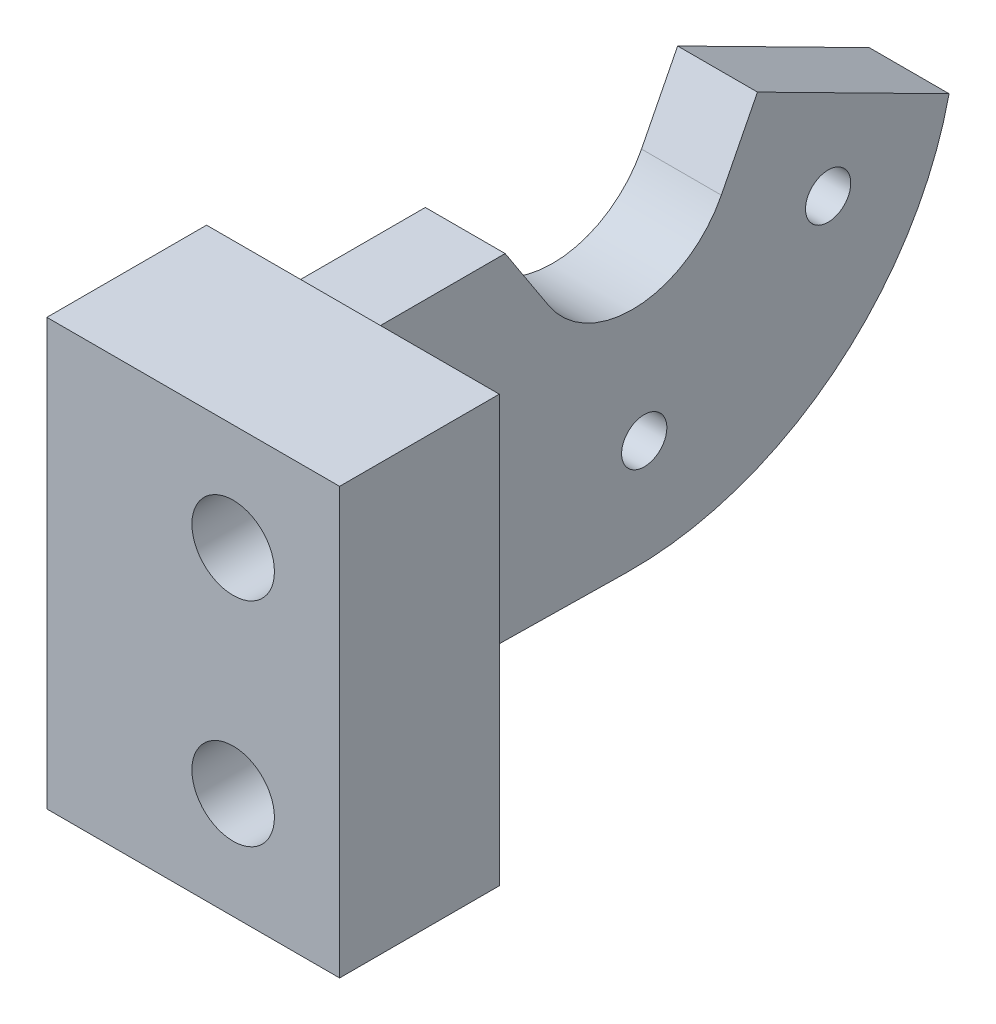
ISO-10303-21;
HEADER;
FILE_DESCRIPTION(('STEP AP214'),'2;1');
FILE_NAME('part.step','',(''),(''),'','','');
FILE_SCHEMA(('AUTOMOTIVE_DESIGN { 1 0 10303 214 1 1 1 1 }'));
ENDSEC;
DATA;
#1=APPLICATION_CONTEXT('core data for automotive mechanical design processes');
#2=APPLICATION_PROTOCOL_DEFINITION('international standard','automotive_design',2000,#1);
#3=PRODUCT_CONTEXT('',#1,'mechanical');
#4=PRODUCT('Part','Part','',(#3));
#5=PRODUCT_RELATED_PRODUCT_CATEGORY('part','',(#4));
#6=PRODUCT_DEFINITION_FORMATION('','',#4);
#7=PRODUCT_DEFINITION_CONTEXT('part definition',#1,'design');
#8=PRODUCT_DEFINITION('design','',#6,#7);
#9=PRODUCT_DEFINITION_SHAPE('','',#8);
#10=(LENGTH_UNIT() NAMED_UNIT(*) SI_UNIT(.MILLI.,.METRE.));
#11=(NAMED_UNIT(*) PLANE_ANGLE_UNIT() SI_UNIT($,.RADIAN.));
#12=(NAMED_UNIT(*) SI_UNIT($,.STERADIAN.) SOLID_ANGLE_UNIT());
#13=UNCERTAINTY_MEASURE_WITH_UNIT(LENGTH_MEASURE(1.E-05),#10,'distance_accuracy_value','');
#14=(GEOMETRIC_REPRESENTATION_CONTEXT(3) GLOBAL_UNCERTAINTY_ASSIGNED_CONTEXT((#13)) GLOBAL_UNIT_ASSIGNED_CONTEXT((#10,
#11,#12)) REPRESENTATION_CONTEXT('',''));
#15=CARTESIAN_POINT('',(0.,0.,0.));
#16=DIRECTION('',(0.,0.,1.));
#17=DIRECTION('',(1.,0.,0.));
#18=AXIS2_PLACEMENT_3D('',#15,#16,#17);
#19=CARTESIAN_POINT('',(4.,12.,6.));
#20=DIRECTION('',(0.,0.,-1.));
#21=DIRECTION('',(-1.,0.,0.));
#22=AXIS2_PLACEMENT_3D('',#19,#20,#21);
#23=CYLINDRICAL_SURFACE('',#22,1.55);
#24=CARTESIAN_POINT('',(4.,12.,6.));
#25=DIRECTION('',(0.,0.,1.));
#26=DIRECTION('',(1.,0.,0.));
#27=AXIS2_PLACEMENT_3D('',#24,#25,#26);
#28=CIRCLE('',#27,1.55);
#29=CARTESIAN_POINT('',(5.55,12.,6.));
#30=VERTEX_POINT('',#29);
#31=EDGE_CURVE('E395',#30,#30,#28,.T.);
#32=ORIENTED_EDGE('',*,*,#31,.T.);
#33=EDGE_LOOP('',(#32));
#34=FACE_BOUND('',#33,.T.);
#35=CARTESIAN_POINT('',(4.,12.,2.5));
#36=DIRECTION('',(0.,0.,-1.));
#37=DIRECTION('',(-1.,0.,0.));
#38=AXIS2_PLACEMENT_3D('',#35,#36,#37);
#39=CIRCLE('',#38,1.55);
#40=CARTESIAN_POINT('',(2.45,12.,2.5));
#41=VERTEX_POINT('',#40);
#42=EDGE_CURVE('E39',#41,#41,#39,.T.);
#43=ORIENTED_EDGE('',*,*,#42,.T.);
#44=EDGE_LOOP('',(#43));
#45=FACE_BOUND('',#44,.T.);
#46=ADVANCED_FACE('F35',(#34,#45),#23,.F.);
#47=CARTESIAN_POINT('',(4.,4.,6.));
#48=DIRECTION('',(0.,0.,-1.));
#49=DIRECTION('',(-1.,0.,0.));
#50=AXIS2_PLACEMENT_3D('',#47,#48,#49);
#51=CYLINDRICAL_SURFACE('',#50,1.55);
#52=CARTESIAN_POINT('',(4.,4.,6.));
#53=DIRECTION('',(0.,0.,1.));
#54=DIRECTION('',(1.,0.,0.));
#55=AXIS2_PLACEMENT_3D('',#52,#53,#54);
#56=CIRCLE('',#55,1.55);
#57=CARTESIAN_POINT('',(5.55,4.,6.));
#58=VERTEX_POINT('',#57);
#59=EDGE_CURVE('E392',#58,#58,#56,.T.);
#60=ORIENTED_EDGE('',*,*,#59,.T.);
#61=EDGE_LOOP('',(#60));
#62=FACE_BOUND('',#61,.T.);
#63=CARTESIAN_POINT('',(4.,4.,2.5));
#64=DIRECTION('',(0.,0.,-1.));
#65=DIRECTION('',(-1.,0.,0.));
#66=AXIS2_PLACEMENT_3D('',#63,#64,#65);
#67=CIRCLE('',#66,1.55);
#68=CARTESIAN_POINT('',(2.45,4.,2.5));
#69=VERTEX_POINT('',#68);
#70=EDGE_CURVE('E336',#69,#69,#67,.T.);
#71=ORIENTED_EDGE('',*,*,#70,.T.);
#72=EDGE_LOOP('',(#71));
#73=FACE_BOUND('',#72,.T.);
#74=ADVANCED_FACE('F481',(#62,#73),#51,.F.);
#75=CARTESIAN_POINT('',(0.,0.,6.));
#76=DIRECTION('',(0.,0.,-1.));
#77=DIRECTION('',(-1.,0.,0.));
#78=AXIS2_PLACEMENT_3D('',#75,#76,#77);
#79=PLANE('',#78);
#80=DIRECTION('',(-1.,0.,0.));
#81=VECTOR('',#80,1.);
#82=CARTESIAN_POINT('',(0.,16.,6.));
#83=LINE('',#82,#81);
#84=CARTESIAN_POINT('',(8.,16.,6.));
#85=VERTEX_POINT('',#84);
#86=CARTESIAN_POINT('',(-3.,16.,6.));
#87=VERTEX_POINT('',#86);
#88=EDGE_CURVE('E401',#85,#87,#83,.T.);
#89=ORIENTED_EDGE('',*,*,#88,.T.);
#90=DIRECTION('',(0.,1.,0.));
#91=VECTOR('',#90,1.);
#92=CARTESIAN_POINT('',(-3.,0.,6.));
#93=LINE('',#92,#91);
#94=CARTESIAN_POINT('',(-3.,0.,6.));
#95=VERTEX_POINT('',#94);
#96=EDGE_CURVE('E221',#95,#87,#93,.T.);
#97=ORIENTED_EDGE('',*,*,#96,.F.);
#98=DIRECTION('',(1.,0.,0.));
#99=VECTOR('',#98,1.);
#100=CARTESIAN_POINT('',(0.,0.,6.));
#101=LINE('',#100,#99);
#102=CARTESIAN_POINT('',(8.,0.,6.));
#103=VERTEX_POINT('',#102);
#104=EDGE_CURVE('E205',#95,#103,#101,.T.);
#105=ORIENTED_EDGE('',*,*,#104,.T.);
#106=DIRECTION('',(0.,1.,0.));
#107=VECTOR('',#106,1.);
#108=CARTESIAN_POINT('',(8.,0.,6.));
#109=LINE('',#108,#107);
#110=EDGE_CURVE('E399',#103,#85,#109,.T.);
#111=ORIENTED_EDGE('',*,*,#110,.T.);
#112=EDGE_LOOP('',(#89,#97,#105,#111));
#113=FACE_BOUND('',#112,.T.);
#114=ORIENTED_EDGE('',*,*,#31,.F.);
#115=EDGE_LOOP('',(#114));
#116=FACE_BOUND('',#115,.T.);
#117=ORIENTED_EDGE('',*,*,#59,.F.);
#118=EDGE_LOOP('',(#117));
#119=FACE_BOUND('',#118,.T.);
#120=ADVANCED_FACE('F444',(#113,#116,#119),#79,.F.);
#121=CARTESIAN_POINT('',(0.,0.,0.));
#122=DIRECTION('',(0.,0.,-1.));
#123=DIRECTION('',(-1.,0.,0.));
#124=AXIS2_PLACEMENT_3D('',#121,#122,#123);
#125=PLANE('',#124);
#126=DIRECTION('',(-0.5,0.866025403784439,0.));
#127=VECTOR('',#126,1.);
#128=CARTESIAN_POINT('',(2.38341924626905,9.2,0.));
#129=LINE('',#128,#127);
#130=CARTESIAN_POINT('',(2.38341924626905,9.2,0.));
#131=VERTEX_POINT('',#130);
#132=CARTESIAN_POINT('',(0.766838492538097,12.,0.));
#133=VERTEX_POINT('',#132);
#134=EDGE_CURVE('E60',#131,#133,#129,.T.);
#135=ORIENTED_EDGE('',*,*,#134,.F.);
#136=DIRECTION('',(-1.,0.,0.));
#137=VECTOR('',#136,1.);
#138=CARTESIAN_POINT('',(5.61658075373095,9.2,0.));
#139=LINE('',#138,#137);
#140=CARTESIAN_POINT('',(5.61658075373095,9.2,0.));
#141=VERTEX_POINT('',#140);
#142=EDGE_CURVE('E302',#141,#131,#139,.T.);
#143=ORIENTED_EDGE('',*,*,#142,.F.);
#144=DIRECTION('',(-0.5,-0.866025403784439,0.));
#145=VECTOR('',#144,1.);
#146=CARTESIAN_POINT('',(7.2331615074619,12.,0.));
#147=LINE('',#146,#145);
#148=CARTESIAN_POINT('',(7.2331615074619,12.,0.));
#149=VERTEX_POINT('',#148);
#150=EDGE_CURVE('E329',#149,#141,#147,.T.);
#151=ORIENTED_EDGE('',*,*,#150,.F.);
#152=DIRECTION('',(0.5,-0.866025403784439,0.));
#153=VECTOR('',#152,1.);
#154=CARTESIAN_POINT('',(5.61658075373095,14.8,0.));
#155=LINE('',#154,#153);
#156=CARTESIAN_POINT('',(5.61658075373095,14.8,0.));
#157=VERTEX_POINT('',#156);
#158=EDGE_CURVE('E326',#157,#149,#155,.T.);
#159=ORIENTED_EDGE('',*,*,#158,.F.);
#160=DIRECTION('',(1.,0.,0.));
#161=VECTOR('',#160,1.);
#162=CARTESIAN_POINT('',(2.38341924626905,14.8,0.));
#163=LINE('',#162,#161);
#164=CARTESIAN_POINT('',(2.38341924626905,14.8,0.));
#165=VERTEX_POINT('',#164);
#166=EDGE_CURVE('E323',#165,#157,#163,.T.);
#167=ORIENTED_EDGE('',*,*,#166,.F.);
#168=DIRECTION('',(0.5,0.866025403784439,0.));
#169=VECTOR('',#168,1.);
#170=CARTESIAN_POINT('',(0.766838492538097,12.,0.));
#171=LINE('',#170,#169);
#172=EDGE_CURVE('E319',#133,#165,#171,.T.);
#173=ORIENTED_EDGE('',*,*,#172,.F.);
#174=EDGE_LOOP('',(#135,#143,#151,#159,#167,#173));
#175=FACE_BOUND('',#174,.T.);
#176=DIRECTION('',(-0.5,0.866025403784439,0.));
#177=VECTOR('',#176,1.);
#178=CARTESIAN_POINT('',(2.38341924626905,1.20000000000001,0.));
#179=LINE('',#178,#177);
#180=CARTESIAN_POINT('',(2.38341924626905,1.20000000000001,0.));
#181=VERTEX_POINT('',#180);
#182=CARTESIAN_POINT('',(0.7668384925381,4.,0.));
#183=VERTEX_POINT('',#182);
#184=EDGE_CURVE('E297',#181,#183,#179,.T.);
#185=ORIENTED_EDGE('',*,*,#184,.F.);
#186=DIRECTION('',(-1.,0.,0.));
#187=VECTOR('',#186,1.);
#188=CARTESIAN_POINT('',(5.61658075373095,1.20000000000001,0.));
#189=LINE('',#188,#187);
#190=CARTESIAN_POINT('',(5.61658075373095,1.20000000000001,0.));
#191=VERTEX_POINT('',#190);
#192=EDGE_CURVE('E350',#191,#181,#189,.T.);
#193=ORIENTED_EDGE('',*,*,#192,.F.);
#194=DIRECTION('',(-0.5,-0.866025403784439,0.));
#195=VECTOR('',#194,1.);
#196=CARTESIAN_POINT('',(7.2331615074619,4.,0.));
#197=LINE('',#196,#195);
#198=CARTESIAN_POINT('',(7.2331615074619,4.,0.));
#199=VERTEX_POINT('',#198);
#200=EDGE_CURVE('E376',#199,#191,#197,.T.);
#201=ORIENTED_EDGE('',*,*,#200,.F.);
#202=DIRECTION('',(0.5,-0.866025403784438,0.));
#203=VECTOR('',#202,1.);
#204=CARTESIAN_POINT('',(5.61658075373095,6.8,0.));
#205=LINE('',#204,#203);
#206=CARTESIAN_POINT('',(5.61658075373095,6.8,0.));
#207=VERTEX_POINT('',#206);
#208=EDGE_CURVE('E373',#207,#199,#205,.T.);
#209=ORIENTED_EDGE('',*,*,#208,.F.);
#210=DIRECTION('',(1.,0.,0.));
#211=VECTOR('',#210,1.);
#212=CARTESIAN_POINT('',(2.38341924626904,6.8,0.));
#213=LINE('',#212,#211);
#214=CARTESIAN_POINT('',(2.38341924626904,6.8,0.));
#215=VERTEX_POINT('',#214);
#216=EDGE_CURVE('E370',#215,#207,#213,.T.);
#217=ORIENTED_EDGE('',*,*,#216,.F.);
#218=DIRECTION('',(0.499999999999998,0.86602540378444,0.));
#219=VECTOR('',#218,1.);
#220=CARTESIAN_POINT('',(0.7668384925381,4.,0.));
#221=LINE('',#220,#219);
#222=EDGE_CURVE('E367',#183,#215,#221,.T.);
#223=ORIENTED_EDGE('',*,*,#222,.F.);
#224=EDGE_LOOP('',(#185,#193,#201,#209,#217,#223));
#225=FACE_BOUND('',#224,.T.);
#226=DIRECTION('',(0.,-1.,0.));
#227=VECTOR('',#226,1.);
#228=CARTESIAN_POINT('',(0.,0.,0.));
#229=LINE('',#228,#227);
#230=CARTESIAN_POINT('',(0.,12.4653923107867,0.));
#231=VERTEX_POINT('',#230);
#232=CARTESIAN_POINT('',(0.,0.,0.));
#233=VERTEX_POINT('',#232);
#234=EDGE_CURVE('E52',#231,#233,#229,.T.);
#235=ORIENTED_EDGE('',*,*,#234,.F.);
#236=DIRECTION('',(1.,0.,0.));
#237=VECTOR('',#236,1.);
#238=CARTESIAN_POINT('',(-3.,12.4653923107867,0.));
#239=LINE('',#238,#237);
#240=CARTESIAN_POINT('',(-3.,12.4653923107867,0.));
#241=VERTEX_POINT('',#240);
#242=EDGE_CURVE('E210',#241,#231,#239,.T.);
#243=ORIENTED_EDGE('',*,*,#242,.F.);
#244=DIRECTION('',(0.,-1.,0.));
#245=VECTOR('',#244,1.);
#246=CARTESIAN_POINT('',(-3.,0.,0.));
#247=LINE('',#246,#245);
#248=CARTESIAN_POINT('',(-3.,16.,0.));
#249=VERTEX_POINT('',#248);
#250=EDGE_CURVE('E208',#249,#241,#247,.T.);
#251=ORIENTED_EDGE('',*,*,#250,.F.);
#252=DIRECTION('',(-1.,0.,0.));
#253=VECTOR('',#252,1.);
#254=CARTESIAN_POINT('',(0.,16.,0.));
#255=LINE('',#254,#253);
#256=CARTESIAN_POINT('',(8.,16.,0.));
#257=VERTEX_POINT('',#256);
#258=EDGE_CURVE('E197',#257,#249,#255,.T.);
#259=ORIENTED_EDGE('',*,*,#258,.F.);
#260=DIRECTION('',(0.,1.,0.));
#261=VECTOR('',#260,1.);
#262=CARTESIAN_POINT('',(8.,0.,0.));
#263=LINE('',#262,#261);
#264=CARTESIAN_POINT('',(8.,0.,0.));
#265=VERTEX_POINT('',#264);
#266=EDGE_CURVE('E206',#265,#257,#263,.T.);
#267=ORIENTED_EDGE('',*,*,#266,.F.);
#268=DIRECTION('',(1.,0.,0.));
#269=VECTOR('',#268,1.);
#270=CARTESIAN_POINT('',(0.,0.,0.));
#271=LINE('',#270,#269);
#272=EDGE_CURVE('E404',#233,#265,#271,.T.);
#273=ORIENTED_EDGE('',*,*,#272,.F.);
#274=EDGE_LOOP('',(#235,#243,#251,#259,#267,#273));
#275=FACE_BOUND('',#274,.T.);
#276=ADVANCED_FACE('F209',(#175,#225,#275),#125,.T.);
#277=CARTESIAN_POINT('',(0.,0.,6.));
#278=DIRECTION('',(0.,1.,0.));
#279=DIRECTION('',(0.,0.,1.));
#280=AXIS2_PLACEMENT_3D('',#277,#278,#279);
#281=PLANE('',#280);
#282=ORIENTED_EDGE('',*,*,#272,.T.);
#283=DIRECTION('',(0.,0.,-1.));
#284=VECTOR('',#283,1.);
#285=CARTESIAN_POINT('',(8.,0.,6.));
#286=LINE('',#285,#284);
#287=EDGE_CURVE('E11',#103,#265,#286,.T.);
#288=ORIENTED_EDGE('',*,*,#287,.F.);
#289=ORIENTED_EDGE('',*,*,#104,.F.);
#290=DIRECTION('',(0.,0.,1.));
#291=VECTOR('',#290,1.);
#292=CARTESIAN_POINT('',(-3.,0.,0.));
#293=LINE('',#292,#291);
#294=CARTESIAN_POINT('',(-3.,0.,0.));
#295=VERTEX_POINT('',#294);
#296=EDGE_CURVE('E243',#295,#95,#293,.T.);
#297=ORIENTED_EDGE('',*,*,#296,.F.);
#298=DIRECTION('',(1.,0.,0.));
#299=VECTOR('',#298,1.);
#300=CARTESIAN_POINT('',(-3.,0.,0.));
#301=LINE('',#300,#299);
#302=EDGE_CURVE('E255',#295,#233,#301,.T.);
#303=ORIENTED_EDGE('',*,*,#302,.T.);
#304=EDGE_LOOP('',(#282,#288,#289,#297,#303));
#305=FACE_BOUND('',#304,.T.);
#306=ADVANCED_FACE('F37',(#305),#281,.F.);
#307=CARTESIAN_POINT('',(8.,0.,6.));
#308=DIRECTION('',(-1.,0.,0.));
#309=DIRECTION('',(0.,0.,1.));
#310=AXIS2_PLACEMENT_3D('',#307,#308,#309);
#311=PLANE('',#310);
#312=ORIENTED_EDGE('',*,*,#266,.T.);
#313=DIRECTION('',(0.,0.,-1.));
#314=VECTOR('',#313,1.);
#315=CARTESIAN_POINT('',(8.,16.,6.));
#316=LINE('',#315,#314);
#317=EDGE_CURVE('E44',#85,#257,#316,.T.);
#318=ORIENTED_EDGE('',*,*,#317,.F.);
#319=ORIENTED_EDGE('',*,*,#110,.F.);
#320=ORIENTED_EDGE('',*,*,#287,.T.);
#321=EDGE_LOOP('',(#312,#318,#319,#320));
#322=FACE_BOUND('',#321,.T.);
#323=ADVANCED_FACE('F495',(#322),#311,.F.);
#324=CARTESIAN_POINT('',(0.,16.,6.));
#325=DIRECTION('',(0.,-1.,0.));
#326=DIRECTION('',(0.,0.,-1.));
#327=AXIS2_PLACEMENT_3D('',#324,#325,#326);
#328=PLANE('',#327);
#329=ORIENTED_EDGE('',*,*,#258,.T.);
#330=DIRECTION('',(0.,0.,-1.));
#331=VECTOR('',#330,1.);
#332=CARTESIAN_POINT('',(-3.,16.,0.));
#333=LINE('',#332,#331);
#334=EDGE_CURVE('E202',#87,#249,#333,.T.);
#335=ORIENTED_EDGE('',*,*,#334,.F.);
#336=ORIENTED_EDGE('',*,*,#88,.F.);
#337=ORIENTED_EDGE('',*,*,#317,.T.);
#338=EDGE_LOOP('',(#329,#335,#336,#337));
#339=FACE_BOUND('',#338,.T.);
#340=ADVANCED_FACE('F199',(#339),#328,.F.);
#341=CARTESIAN_POINT('',(2.38341924626905,1.20000000000001,2.5));
#342=DIRECTION('',(-0.866025403784438,-0.5,0.));
#343=DIRECTION('',(0.5,-0.866025403784438,0.));
#344=AXIS2_PLACEMENT_3D('',#341,#342,#343);
#345=PLANE('',#344);
#346=ORIENTED_EDGE('',*,*,#184,.T.);
#347=DIRECTION('',(0.,0.,-1.));
#348=VECTOR('',#347,1.);
#349=CARTESIAN_POINT('',(0.7668384925381,4.,2.5));
#350=LINE('',#349,#348);
#351=CARTESIAN_POINT('',(0.7668384925381,4.,2.5));
#352=VERTEX_POINT('',#351);
#353=EDGE_CURVE('E365',#352,#183,#350,.T.);
#354=ORIENTED_EDGE('',*,*,#353,.F.);
#355=DIRECTION('',(-0.5,0.866025403784439,0.));
#356=VECTOR('',#355,1.);
#357=CARTESIAN_POINT('',(2.38341924626905,1.20000000000001,2.5));
#358=LINE('',#357,#356);
#359=CARTESIAN_POINT('',(2.38341924626905,1.20000000000001,2.5));
#360=VERTEX_POINT('',#359);
#361=EDGE_CURVE('E346',#360,#352,#358,.T.);
#362=ORIENTED_EDGE('',*,*,#361,.F.);
#363=DIRECTION('',(0.,0.,-1.));
#364=VECTOR('',#363,1.);
#365=CARTESIAN_POINT('',(2.38341924626905,1.20000000000001,2.5));
#366=LINE('',#365,#364);
#367=EDGE_CURVE('E320',#360,#181,#366,.T.);
#368=ORIENTED_EDGE('',*,*,#367,.T.);
#369=EDGE_LOOP('',(#346,#354,#362,#368));
#370=FACE_BOUND('',#369,.T.);
#371=ADVANCED_FACE('F452',(#370),#345,.F.);
#372=CARTESIAN_POINT('',(5.61658075373095,1.20000000000001,2.5));
#373=DIRECTION('',(0.,-1.,0.));
#374=DIRECTION('',(0.,0.,-1.));
#375=AXIS2_PLACEMENT_3D('',#372,#373,#374);
#376=PLANE('',#375);
#377=ORIENTED_EDGE('',*,*,#192,.T.);
#378=ORIENTED_EDGE('',*,*,#367,.F.);
#379=DIRECTION('',(-1.,0.,0.));
#380=VECTOR('',#379,1.);
#381=CARTESIAN_POINT('',(5.61658075373095,1.20000000000001,2.5));
#382=LINE('',#381,#380);
#383=CARTESIAN_POINT('',(5.61658075373095,1.20000000000001,2.5));
#384=VERTEX_POINT('',#383);
#385=EDGE_CURVE('E362',#384,#360,#382,.T.);
#386=ORIENTED_EDGE('',*,*,#385,.F.);
#387=DIRECTION('',(0.,0.,-1.));
#388=VECTOR('',#387,1.);
#389=CARTESIAN_POINT('',(5.61658075373095,1.20000000000001,2.5));
#390=LINE('',#389,#388);
#391=EDGE_CURVE('E382',#384,#191,#390,.T.);
#392=ORIENTED_EDGE('',*,*,#391,.T.);
#393=EDGE_LOOP('',(#377,#378,#386,#392));
#394=FACE_BOUND('',#393,.T.);
#395=ADVANCED_FACE('F463',(#394),#376,.F.);
#396=CARTESIAN_POINT('',(7.2331615074619,4.,2.5));
#397=DIRECTION('',(0.866025403784439,-0.5,0.));
#398=DIRECTION('',(0.5,0.866025403784439,0.));
#399=AXIS2_PLACEMENT_3D('',#396,#397,#398);
#400=PLANE('',#399);
#401=ORIENTED_EDGE('',*,*,#200,.T.);
#402=ORIENTED_EDGE('',*,*,#391,.F.);
#403=DIRECTION('',(-0.5,-0.866025403784439,0.));
#404=VECTOR('',#403,1.);
#405=CARTESIAN_POINT('',(7.2331615074619,4.,2.5));
#406=LINE('',#405,#404);
#407=CARTESIAN_POINT('',(7.2331615074619,4.,2.5));
#408=VERTEX_POINT('',#407);
#409=EDGE_CURVE('E359',#408,#384,#406,.T.);
#410=ORIENTED_EDGE('',*,*,#409,.F.);
#411=DIRECTION('',(0.,0.,-1.));
#412=VECTOR('',#411,1.);
#413=CARTESIAN_POINT('',(7.2331615074619,4.,2.5));
#414=LINE('',#413,#412);
#415=EDGE_CURVE('E384',#408,#199,#414,.T.);
#416=ORIENTED_EDGE('',*,*,#415,.T.);
#417=EDGE_LOOP('',(#401,#402,#410,#416));
#418=FACE_BOUND('',#417,.T.);
#419=ADVANCED_FACE('F465',(#418),#400,.F.);
#420=CARTESIAN_POINT('',(5.61658075373095,6.8,2.5));
#421=DIRECTION('',(0.866025403784438,0.5,0.));
#422=DIRECTION('',(-0.5,0.866025403784439,0.));
#423=AXIS2_PLACEMENT_3D('',#420,#421,#422);
#424=PLANE('',#423);
#425=ORIENTED_EDGE('',*,*,#208,.T.);
#426=ORIENTED_EDGE('',*,*,#415,.F.);
#427=DIRECTION('',(0.5,-0.866025403784438,0.));
#428=VECTOR('',#427,1.);
#429=CARTESIAN_POINT('',(5.61658075373095,6.8,2.5));
#430=LINE('',#429,#428);
#431=CARTESIAN_POINT('',(5.61658075373095,6.8,2.5));
#432=VERTEX_POINT('',#431);
#433=EDGE_CURVE('E356',#432,#408,#430,.T.);
#434=ORIENTED_EDGE('',*,*,#433,.F.);
#435=DIRECTION('',(0.,0.,-1.));
#436=VECTOR('',#435,1.);
#437=CARTESIAN_POINT('',(5.61658075373095,6.8,2.5));
#438=LINE('',#437,#436);
#439=EDGE_CURVE('E386',#432,#207,#438,.T.);
#440=ORIENTED_EDGE('',*,*,#439,.T.);
#441=EDGE_LOOP('',(#425,#426,#434,#440));
#442=FACE_BOUND('',#441,.T.);
#443=ADVANCED_FACE('F468',(#442),#424,.F.);
#444=CARTESIAN_POINT('',(2.38341924626904,6.8,2.5));
#445=DIRECTION('',(0.,1.,0.));
#446=DIRECTION('',(0.,0.,1.));
#447=AXIS2_PLACEMENT_3D('',#444,#445,#446);
#448=PLANE('',#447);
#449=ORIENTED_EDGE('',*,*,#216,.T.);
#450=ORIENTED_EDGE('',*,*,#439,.F.);
#451=DIRECTION('',(1.,0.,0.));
#452=VECTOR('',#451,1.);
#453=CARTESIAN_POINT('',(2.38341924626904,6.8,2.5));
#454=LINE('',#453,#452);
#455=CARTESIAN_POINT('',(2.38341924626904,6.8,2.5));
#456=VERTEX_POINT('',#455);
#457=EDGE_CURVE('E353',#456,#432,#454,.T.);
#458=ORIENTED_EDGE('',*,*,#457,.F.);
#459=DIRECTION('',(0.,0.,-1.));
#460=VECTOR('',#459,1.);
#461=CARTESIAN_POINT('',(2.38341924626904,6.8,2.5));
#462=LINE('',#461,#460);
#463=EDGE_CURVE('E388',#456,#215,#462,.T.);
#464=ORIENTED_EDGE('',*,*,#463,.T.);
#465=EDGE_LOOP('',(#449,#450,#458,#464));
#466=FACE_BOUND('',#465,.T.);
#467=ADVANCED_FACE('F471',(#466),#448,.F.);
#468=CARTESIAN_POINT('',(0.7668384925381,4.,2.5));
#469=DIRECTION('',(-0.86602540378444,0.499999999999998,0.));
#470=DIRECTION('',(-0.499999999999998,-0.86602540378444,0.));
#471=AXIS2_PLACEMENT_3D('',#468,#469,#470);
#472=PLANE('',#471);
#473=ORIENTED_EDGE('',*,*,#222,.T.);
#474=ORIENTED_EDGE('',*,*,#463,.F.);
#475=DIRECTION('',(0.499999999999998,0.86602540378444,0.));
#476=VECTOR('',#475,1.);
#477=CARTESIAN_POINT('',(0.7668384925381,4.,2.5));
#478=LINE('',#477,#476);
#479=EDGE_CURVE('E349',#352,#456,#478,.T.);
#480=ORIENTED_EDGE('',*,*,#479,.F.);
#481=ORIENTED_EDGE('',*,*,#353,.T.);
#482=EDGE_LOOP('',(#473,#474,#480,#481));
#483=FACE_BOUND('',#482,.T.);
#484=ADVANCED_FACE('F456',(#483),#472,.F.);
#485=CARTESIAN_POINT('',(0.,0.,2.5));
#486=DIRECTION('',(0.,0.,-1.));
#487=DIRECTION('',(-1.,0.,0.));
#488=AXIS2_PLACEMENT_3D('',#485,#486,#487);
#489=PLANE('',#488);
#490=ORIENTED_EDGE('',*,*,#70,.F.);
#491=EDGE_LOOP('',(#490));
#492=FACE_BOUND('',#491,.T.);
#493=ORIENTED_EDGE('',*,*,#361,.T.);
#494=ORIENTED_EDGE('',*,*,#479,.T.);
#495=ORIENTED_EDGE('',*,*,#457,.T.);
#496=ORIENTED_EDGE('',*,*,#433,.T.);
#497=ORIENTED_EDGE('',*,*,#409,.T.);
#498=ORIENTED_EDGE('',*,*,#385,.T.);
#499=EDGE_LOOP('',(#493,#494,#495,#496,#497,#498));
#500=FACE_BOUND('',#499,.T.);
#501=ADVANCED_FACE('F459',(#492,#500),#489,.T.);
#502=CARTESIAN_POINT('',(2.38341924626905,9.2,2.5));
#503=DIRECTION('',(-0.866025403784439,-0.5,0.));
#504=DIRECTION('',(0.5,-0.866025403784439,0.));
#505=AXIS2_PLACEMENT_3D('',#502,#503,#504);
#506=PLANE('',#505);
#507=ORIENTED_EDGE('',*,*,#134,.T.);
#508=DIRECTION('',(0.,0.,-1.));
#509=VECTOR('',#508,1.);
#510=CARTESIAN_POINT('',(0.766838492538097,12.,2.5));
#511=LINE('',#510,#509);
#512=CARTESIAN_POINT('',(0.766838492538097,12.,2.5));
#513=VERTEX_POINT('',#512);
#514=EDGE_CURVE('E317',#513,#133,#511,.T.);
#515=ORIENTED_EDGE('',*,*,#514,.F.);
#516=DIRECTION('',(-0.5,0.866025403784439,0.));
#517=VECTOR('',#516,1.);
#518=CARTESIAN_POINT('',(2.38341924626905,9.2,2.5));
#519=LINE('',#518,#517);
#520=CARTESIAN_POINT('',(2.38341924626905,9.2,2.5));
#521=VERTEX_POINT('',#520);
#522=EDGE_CURVE('E298',#521,#513,#519,.T.);
#523=ORIENTED_EDGE('',*,*,#522,.F.);
#524=DIRECTION('',(0.,0.,-1.));
#525=VECTOR('',#524,1.);
#526=CARTESIAN_POINT('',(2.38341924626905,9.2,2.5));
#527=LINE('',#526,#525);
#528=EDGE_CURVE('E334',#521,#131,#527,.T.);
#529=ORIENTED_EDGE('',*,*,#528,.T.);
#530=EDGE_LOOP('',(#507,#515,#523,#529));
#531=FACE_BOUND('',#530,.T.);
#532=ADVANCED_FACE('F423',(#531),#506,.F.);
#533=CARTESIAN_POINT('',(5.61658075373095,9.2,2.5));
#534=DIRECTION('',(0.,-1.,0.));
#535=DIRECTION('',(0.,0.,-1.));
#536=AXIS2_PLACEMENT_3D('',#533,#534,#535);
#537=PLANE('',#536);
#538=ORIENTED_EDGE('',*,*,#142,.T.);
#539=ORIENTED_EDGE('',*,*,#528,.F.);
#540=DIRECTION('',(-1.,0.,0.));
#541=VECTOR('',#540,1.);
#542=CARTESIAN_POINT('',(5.61658075373095,9.2,2.5));
#543=LINE('',#542,#541);
#544=CARTESIAN_POINT('',(5.61658075373095,9.2,2.5));
#545=VERTEX_POINT('',#544);
#546=EDGE_CURVE('E314',#545,#521,#543,.T.);
#547=ORIENTED_EDGE('',*,*,#546,.F.);
#548=DIRECTION('',(0.,0.,-1.));
#549=VECTOR('',#548,1.);
#550=CARTESIAN_POINT('',(5.61658075373095,9.2,2.5));
#551=LINE('',#550,#549);
#552=EDGE_CURVE('E337',#545,#141,#551,.T.);
#553=ORIENTED_EDGE('',*,*,#552,.T.);
#554=EDGE_LOOP('',(#538,#539,#547,#553));
#555=FACE_BOUND('',#554,.T.);
#556=ADVANCED_FACE('F440',(#555),#537,.F.);
#557=CARTESIAN_POINT('',(7.2331615074619,12.,2.5));
#558=DIRECTION('',(0.866025403784439,-0.5,0.));
#559=DIRECTION('',(0.5,0.866025403784439,0.));
#560=AXIS2_PLACEMENT_3D('',#557,#558,#559);
#561=PLANE('',#560);
#562=ORIENTED_EDGE('',*,*,#150,.T.);
#563=ORIENTED_EDGE('',*,*,#552,.F.);
#564=DIRECTION('',(-0.5,-0.866025403784439,0.));
#565=VECTOR('',#564,1.);
#566=CARTESIAN_POINT('',(7.2331615074619,12.,2.5));
#567=LINE('',#566,#565);
#568=CARTESIAN_POINT('',(7.2331615074619,12.,2.5));
#569=VERTEX_POINT('',#568);
#570=EDGE_CURVE('E311',#569,#545,#567,.T.);
#571=ORIENTED_EDGE('',*,*,#570,.F.);
#572=DIRECTION('',(0.,0.,-1.));
#573=VECTOR('',#572,1.);
#574=CARTESIAN_POINT('',(7.2331615074619,12.,2.5));
#575=LINE('',#574,#573);
#576=EDGE_CURVE('E339',#569,#149,#575,.T.);
#577=ORIENTED_EDGE('',*,*,#576,.T.);
#578=EDGE_LOOP('',(#562,#563,#571,#577));
#579=FACE_BOUND('',#578,.T.);
#580=ADVANCED_FACE('F437',(#579),#561,.F.);
#581=CARTESIAN_POINT('',(5.61658075373095,14.8,2.5));
#582=DIRECTION('',(0.866025403784439,0.5,0.));
#583=DIRECTION('',(-0.5,0.866025403784439,0.));
#584=AXIS2_PLACEMENT_3D('',#581,#582,#583);
#585=PLANE('',#584);
#586=ORIENTED_EDGE('',*,*,#158,.T.);
#587=ORIENTED_EDGE('',*,*,#576,.F.);
#588=DIRECTION('',(0.5,-0.866025403784439,0.));
#589=VECTOR('',#588,1.);
#590=CARTESIAN_POINT('',(5.61658075373095,14.8,2.5));
#591=LINE('',#590,#589);
#592=CARTESIAN_POINT('',(5.61658075373095,14.8,2.5));
#593=VERTEX_POINT('',#592);
#594=EDGE_CURVE('E308',#593,#569,#591,.T.);
#595=ORIENTED_EDGE('',*,*,#594,.F.);
#596=DIRECTION('',(0.,0.,-1.));
#597=VECTOR('',#596,1.);
#598=CARTESIAN_POINT('',(5.61658075373095,14.8,2.5));
#599=LINE('',#598,#597);
#600=EDGE_CURVE('E341',#593,#157,#599,.T.);
#601=ORIENTED_EDGE('',*,*,#600,.T.);
#602=EDGE_LOOP('',(#586,#587,#595,#601));
#603=FACE_BOUND('',#602,.T.);
#604=ADVANCED_FACE('F433',(#603),#585,.F.);
#605=CARTESIAN_POINT('',(2.38341924626905,14.8,2.5));
#606=DIRECTION('',(0.,1.,0.));
#607=DIRECTION('',(0.,0.,1.));
#608=AXIS2_PLACEMENT_3D('',#605,#606,#607);
#609=PLANE('',#608);
#610=ORIENTED_EDGE('',*,*,#166,.T.);
#611=ORIENTED_EDGE('',*,*,#600,.F.);
#612=DIRECTION('',(1.,0.,0.));
#613=VECTOR('',#612,1.);
#614=CARTESIAN_POINT('',(2.38341924626905,14.8,2.5));
#615=LINE('',#614,#613);
#616=CARTESIAN_POINT('',(2.38341924626905,14.8,2.5));
#617=VERTEX_POINT('',#616);
#618=EDGE_CURVE('E305',#617,#593,#615,.T.);
#619=ORIENTED_EDGE('',*,*,#618,.F.);
#620=DIRECTION('',(0.,0.,-1.));
#621=VECTOR('',#620,1.);
#622=CARTESIAN_POINT('',(2.38341924626905,14.8,2.5));
#623=LINE('',#622,#621);
#624=EDGE_CURVE('E343',#617,#165,#623,.T.);
#625=ORIENTED_EDGE('',*,*,#624,.T.);
#626=EDGE_LOOP('',(#610,#611,#619,#625));
#627=FACE_BOUND('',#626,.T.);
#628=ADVANCED_FACE('F429',(#627),#609,.F.);
#629=CARTESIAN_POINT('',(0.766838492538097,12.,2.5));
#630=DIRECTION('',(-0.866025403784439,0.5,0.));
#631=DIRECTION('',(-0.5,-0.866025403784439,0.));
#632=AXIS2_PLACEMENT_3D('',#629,#630,#631);
#633=PLANE('',#632);
#634=ORIENTED_EDGE('',*,*,#172,.T.);
#635=ORIENTED_EDGE('',*,*,#624,.F.);
#636=DIRECTION('',(0.5,0.866025403784439,0.));
#637=VECTOR('',#636,1.);
#638=CARTESIAN_POINT('',(0.766838492538097,12.,2.5));
#639=LINE('',#638,#637);
#640=EDGE_CURVE('E301',#513,#617,#639,.T.);
#641=ORIENTED_EDGE('',*,*,#640,.F.);
#642=ORIENTED_EDGE('',*,*,#514,.T.);
#643=EDGE_LOOP('',(#634,#635,#641,#642));
#644=FACE_BOUND('',#643,.T.);
#645=ADVANCED_FACE('F418',(#644),#633,.F.);
#646=CARTESIAN_POINT('',(0.,0.,2.5));
#647=DIRECTION('',(0.,0.,-1.));
#648=DIRECTION('',(-1.,0.,0.));
#649=AXIS2_PLACEMENT_3D('',#646,#647,#648);
#650=PLANE('',#649);
#651=ORIENTED_EDGE('',*,*,#42,.F.);
#652=EDGE_LOOP('',(#651));
#653=FACE_BOUND('',#652,.T.);
#654=ORIENTED_EDGE('',*,*,#522,.T.);
#655=ORIENTED_EDGE('',*,*,#640,.T.);
#656=ORIENTED_EDGE('',*,*,#618,.T.);
#657=ORIENTED_EDGE('',*,*,#594,.T.);
#658=ORIENTED_EDGE('',*,*,#570,.T.);
#659=ORIENTED_EDGE('',*,*,#546,.T.);
#660=EDGE_LOOP('',(#654,#655,#656,#657,#658,#659));
#661=FACE_BOUND('',#660,.T.);
#662=ADVANCED_FACE('F414',(#653,#661),#650,.T.);
#663=CARTESIAN_POINT('',(0.,0.,0.));
#664=DIRECTION('',(-1.,0.,0.));
#665=DIRECTION('',(0.,0.,1.));
#666=AXIS2_PLACEMENT_3D('',#663,#664,#665);
#667=PLANE('',#666);
#668=CARTESIAN_POINT('',(0.,7.49483018707541,-6.08870887918089));
#669=DIRECTION('',(-1.,0.,0.));
#670=DIRECTION('',(0.,0.,1.));
#671=AXIS2_PLACEMENT_3D('',#668,#669,#670);
#672=CIRCLE('',#671,0.85);
#673=CARTESIAN_POINT('',(0.,7.49483018707541,-5.23870887918089));
#674=VERTEX_POINT('',#673);
#675=EDGE_CURVE('E274',#674,#674,#672,.T.);
#676=ORIENTED_EDGE('',*,*,#675,.T.);
#677=EDGE_LOOP('',(#676));
#678=FACE_BOUND('',#677,.T.);
#679=CARTESIAN_POINT('',(0.,3.76206140995852,-13.4459459459459));
#680=DIRECTION('',(-1.,0.,0.));
#681=DIRECTION('',(0.,0.,1.));
#682=AXIS2_PLACEMENT_3D('',#679,#680,#681);
#683=CIRCLE('',#682,0.849999999999987);
#684=CARTESIAN_POINT('',(0.,3.76206140995852,-12.595945945946));
#685=VERTEX_POINT('',#684);
#686=EDGE_CURVE('E225',#685,#685,#683,.T.);
#687=ORIENTED_EDGE('',*,*,#686,.T.);
#688=EDGE_LOOP('',(#687));
#689=FACE_BOUND('',#688,.T.);
#690=CARTESIAN_POINT('',(0.,8.26723122288315,-20.3572370667651));
#691=DIRECTION('',(-1.,0.,0.));
#692=DIRECTION('',(0.,0.,1.));
#693=AXIS2_PLACEMENT_3D('',#690,#691,#692);
#694=CIRCLE('',#693,0.849999999999993);
#695=CARTESIAN_POINT('',(0.,8.26723122288315,-19.5072370667651));
#696=VERTEX_POINT('',#695);
#697=EDGE_CURVE('E222',#696,#696,#694,.T.);
#698=ORIENTED_EDGE('',*,*,#697,.T.);
#699=EDGE_LOOP('',(#698));
#700=FACE_BOUND('',#699,.T.);
#701=DIRECTION('',(0.,0.,1.));
#702=VECTOR('',#701,1.);
#703=CARTESIAN_POINT('',(0.,12.4653923107867,0.));
#704=LINE('',#703,#702);
#705=CARTESIAN_POINT('',(0.,12.4653923107867,-8.22026046765511));
#706=VERTEX_POINT('',#705);
#707=EDGE_CURVE('E256',#706,#231,#704,.T.);
#708=ORIENTED_EDGE('',*,*,#707,.T.);
#709=ORIENTED_EDGE('',*,*,#234,.T.);
#710=DIRECTION('',(0.,0.0154954414400929,0.999879938439899));
#711=VECTOR('',#710,1.);
#712=CARTESIAN_POINT('',(0.,0.,0.));
#713=LINE('',#712,#711);
#714=CARTESIAN_POINT('',(0.,-0.198535248966769,-12.8109556144309));
#715=VERTEX_POINT('',#714);
#716=EDGE_CURVE('E271',#715,#233,#713,.T.);
#717=ORIENTED_EDGE('',*,*,#716,.F.);
#718=CARTESIAN_POINT('',(0.,12.,-13.));
#719=DIRECTION('',(-1.,0.,0.));
#720=DIRECTION('',(0.,0.,1.));
#721=AXIS2_PLACEMENT_3D('',#718,#719,#720);
#722=CIRCLE('',#721,12.2);
#723=CARTESIAN_POINT('',(0.,9.32487766594535,-24.9030970968837));
#724=VERTEX_POINT('',#723);
#725=EDGE_CURVE('E269',#724,#715,#722,.T.);
#726=ORIENTED_EDGE('',*,*,#725,.F.);
#727=DIRECTION('',(0.,-0.45245682146871,-0.891786311123036));
#728=VECTOR('',#727,1.);
#729=CARTESIAN_POINT('',(0.,17.4641852267267,-8.86063134034292));
#730=LINE('',#729,#728);
#731=CARTESIAN_POINT('',(0.,12.9786458528615,-17.7015691311175));
#732=VERTEX_POINT('',#731);
#733=EDGE_CURVE('E267',#732,#724,#730,.T.);
#734=ORIENTED_EDGE('',*,*,#733,.F.);
#735=DIRECTION('',(0.,0.891786311123036,-0.45245682146871));
#736=VECTOR('',#735,1.);
#737=CARTESIAN_POINT('',(0.,-4.4855393738653,-8.84093779077459));
#738=LINE('',#737,#736);
#739=CARTESIAN_POINT('',(0.,10.3032869194923,-16.3441986667114));
#740=VERTEX_POINT('',#739);
#741=EDGE_CURVE('E265',#740,#732,#738,.T.);
#742=ORIENTED_EDGE('',*,*,#741,.F.);
#743=CARTESIAN_POINT('',(0.,12.,-13.));
#744=DIRECTION('',(-1.,0.,0.));
#745=DIRECTION('',(0.,0.,1.));
#746=AXIS2_PLACEMENT_3D('',#743,#744,#745);
#747=CIRCLE('',#746,3.75);
#748=CARTESIAN_POINT('',(0.,9.95219553957974,-9.85850403599132));
#749=VERTEX_POINT('',#748);
#750=EDGE_CURVE('E262',#740,#749,#747,.T.);
#751=ORIENTED_EDGE('',*,*,#750,.T.);
#752=DIRECTION('',(0.,0.837732257068983,0.546081189445404));
#753=VECTOR('',#752,1.);
#754=CARTESIAN_POINT('',(0.,7.47775928107419,-11.4714813134561));
#755=LINE('',#754,#753);
#756=EDGE_CURVE('E259',#749,#706,#755,.T.);
#757=ORIENTED_EDGE('',*,*,#756,.T.);
#758=EDGE_LOOP('',(#708,#709,#717,#726,#734,#742,#751,#757));
#759=FACE_BOUND('',#758,.T.);
#760=ADVANCED_FACE('F417',(#678,#689,#700,#759),#667,.F.);
#761=CARTESIAN_POINT('',(-3.,12.4653923107867,0.));
#762=DIRECTION('',(0.,1.,0.));
#763=DIRECTION('',(0.,0.,1.));
#764=AXIS2_PLACEMENT_3D('',#761,#762,#763);
#765=PLANE('',#764);
#766=ORIENTED_EDGE('',*,*,#707,.F.);
#767=DIRECTION('',(1.,0.,0.));
#768=VECTOR('',#767,1.);
#769=CARTESIAN_POINT('',(-3.,12.4653923107867,-8.22026046765511));
#770=LINE('',#769,#768);
#771=CARTESIAN_POINT('',(-3.,12.4653923107867,-8.22026046765511));
#772=VERTEX_POINT('',#771);
#773=EDGE_CURVE('E294',#772,#706,#770,.T.);
#774=ORIENTED_EDGE('',*,*,#773,.F.);
#775=DIRECTION('',(0.,0.,1.));
#776=VECTOR('',#775,1.);
#777=CARTESIAN_POINT('',(-3.,12.4653923107867,0.));
#778=LINE('',#777,#776);
#779=EDGE_CURVE('E214',#772,#241,#778,.T.);
#780=ORIENTED_EDGE('',*,*,#779,.T.);
#781=ORIENTED_EDGE('',*,*,#242,.T.);
#782=EDGE_LOOP('',(#766,#774,#780,#781));
#783=FACE_BOUND('',#782,.T.);
#784=ADVANCED_FACE('F540',(#783),#765,.T.);
#785=CARTESIAN_POINT('',(-3.,7.47775928107419,-11.4714813134561));
#786=DIRECTION('',(0.,0.546081189445404,-0.837732257068983));
#787=DIRECTION('',(0.,0.837732257068983,0.546081189445404));
#788=AXIS2_PLACEMENT_3D('',#785,#786,#787);
#789=PLANE('',#788);
#790=ORIENTED_EDGE('',*,*,#756,.F.);
#791=DIRECTION('',(1.,0.,0.));
#792=VECTOR('',#791,1.);
#793=CARTESIAN_POINT('',(-3.,9.95219553957974,-9.85850403599132));
#794=LINE('',#793,#792);
#795=CARTESIAN_POINT('',(-3.,9.95219553957974,-9.85850403599132));
#796=VERTEX_POINT('',#795);
#797=EDGE_CURVE('E292',#796,#749,#794,.T.);
#798=ORIENTED_EDGE('',*,*,#797,.F.);
#799=DIRECTION('',(0.,0.837732257068983,0.546081189445404));
#800=VECTOR('',#799,1.);
#801=CARTESIAN_POINT('',(-3.,7.47775928107419,-11.4714813134561));
#802=LINE('',#801,#800);
#803=EDGE_CURVE('E229',#796,#772,#802,.T.);
#804=ORIENTED_EDGE('',*,*,#803,.T.);
#805=ORIENTED_EDGE('',*,*,#773,.T.);
#806=EDGE_LOOP('',(#790,#798,#804,#805));
#807=FACE_BOUND('',#806,.T.);
#808=ADVANCED_FACE('F537',(#807),#789,.T.);
#809=CARTESIAN_POINT('',(-3.,12.,-13.));
#810=DIRECTION('',(1.,0.,0.));
#811=DIRECTION('',(0.,0.,-1.));
#812=AXIS2_PLACEMENT_3D('',#809,#810,#811);
#813=CYLINDRICAL_SURFACE('',#812,3.75);
#814=ORIENTED_EDGE('',*,*,#750,.F.);
#815=DIRECTION('',(1.,0.,0.));
#816=VECTOR('',#815,1.);
#817=CARTESIAN_POINT('',(-3.,10.3032869194923,-16.3441986667114));
#818=LINE('',#817,#816);
#819=CARTESIAN_POINT('',(-3.,10.3032869194923,-16.3441986667114));
#820=VERTEX_POINT('',#819);
#821=EDGE_CURVE('E290',#820,#740,#818,.T.);
#822=ORIENTED_EDGE('',*,*,#821,.F.);
#823=CARTESIAN_POINT('',(-3.,12.,-13.));
#824=DIRECTION('',(-1.,0.,0.));
#825=DIRECTION('',(0.,0.,1.));
#826=AXIS2_PLACEMENT_3D('',#823,#824,#825);
#827=CIRCLE('',#826,3.75);
#828=EDGE_CURVE('E232',#820,#796,#827,.T.);
#829=ORIENTED_EDGE('',*,*,#828,.T.);
#830=ORIENTED_EDGE('',*,*,#797,.T.);
#831=EDGE_LOOP('',(#814,#822,#829,#830));
#832=FACE_BOUND('',#831,.T.);
#833=ADVANCED_FACE('F534',(#832),#813,.F.);
#834=CARTESIAN_POINT('',(-3.,-4.4855393738653,-8.84093779077459));
#835=DIRECTION('',(0.,-0.45245682146871,-0.891786311123036));
#836=DIRECTION('',(0.,0.891786311123036,-0.45245682146871));
#837=AXIS2_PLACEMENT_3D('',#834,#835,#836);
#838=PLANE('',#837);
#839=ORIENTED_EDGE('',*,*,#741,.T.);
#840=DIRECTION('',(1.,0.,0.));
#841=VECTOR('',#840,1.);
#842=CARTESIAN_POINT('',(-3.,12.9786458528615,-17.7015691311175));
#843=LINE('',#842,#841);
#844=CARTESIAN_POINT('',(-3.,12.9786458528615,-17.7015691311175));
#845=VERTEX_POINT('',#844);
#846=EDGE_CURVE('E287',#845,#732,#843,.T.);
#847=ORIENTED_EDGE('',*,*,#846,.F.);
#848=DIRECTION('',(0.,0.891786311123036,-0.45245682146871));
#849=VECTOR('',#848,1.);
#850=CARTESIAN_POINT('',(-3.,-4.4855393738653,-8.84093779077459));
#851=LINE('',#850,#849);
#852=EDGE_CURVE('E235',#820,#845,#851,.T.);
#853=ORIENTED_EDGE('',*,*,#852,.F.);
#854=ORIENTED_EDGE('',*,*,#821,.T.);
#855=EDGE_LOOP('',(#839,#847,#853,#854));
#856=FACE_BOUND('',#855,.T.);
#857=ADVANCED_FACE('F531',(#856),#838,.F.);
#858=CARTESIAN_POINT('',(-3.,17.4641852267267,-8.86063134034292));
#859=DIRECTION('',(0.,-0.891786311123036,0.452456821468709));
#860=DIRECTION('',(0.,-0.45245682146871,-0.891786311123036));
#861=AXIS2_PLACEMENT_3D('',#858,#859,#860);
#862=PLANE('',#861);
#863=ORIENTED_EDGE('',*,*,#733,.T.);
#864=DIRECTION('',(1.,0.,0.));
#865=VECTOR('',#864,1.);
#866=CARTESIAN_POINT('',(-3.,9.32487766594535,-24.9030970968837));
#867=LINE('',#866,#865);
#868=CARTESIAN_POINT('',(-3.,9.32487766594535,-24.9030970968837));
#869=VERTEX_POINT('',#868);
#870=EDGE_CURVE('E284',#869,#724,#867,.T.);
#871=ORIENTED_EDGE('',*,*,#870,.F.);
#872=DIRECTION('',(0.,-0.45245682146871,-0.891786311123036));
#873=VECTOR('',#872,1.);
#874=CARTESIAN_POINT('',(-3.,17.4641852267267,-8.86063134034292));
#875=LINE('',#874,#873);
#876=EDGE_CURVE('E237',#845,#869,#875,.T.);
#877=ORIENTED_EDGE('',*,*,#876,.F.);
#878=ORIENTED_EDGE('',*,*,#846,.T.);
#879=EDGE_LOOP('',(#863,#871,#877,#878));
#880=FACE_BOUND('',#879,.T.);
#881=ADVANCED_FACE('F527',(#880),#862,.F.);
#882=CARTESIAN_POINT('',(-3.,12.,-13.));
#883=DIRECTION('',(1.,0.,0.));
#884=DIRECTION('',(0.,0.,-1.));
#885=AXIS2_PLACEMENT_3D('',#882,#883,#884);
#886=CYLINDRICAL_SURFACE('',#885,12.2);
#887=ORIENTED_EDGE('',*,*,#725,.T.);
#888=DIRECTION('',(1.,0.,0.));
#889=VECTOR('',#888,1.);
#890=CARTESIAN_POINT('',(-3.,-0.198535248966769,-12.8109556144309));
#891=LINE('',#890,#889);
#892=CARTESIAN_POINT('',(-3.,-0.198535248966769,-12.8109556144309));
#893=VERTEX_POINT('',#892);
#894=EDGE_CURVE('E281',#893,#715,#891,.T.);
#895=ORIENTED_EDGE('',*,*,#894,.F.);
#896=CARTESIAN_POINT('',(-3.,12.,-13.));
#897=DIRECTION('',(-1.,0.,0.));
#898=DIRECTION('',(0.,0.,1.));
#899=AXIS2_PLACEMENT_3D('',#896,#897,#898);
#900=CIRCLE('',#899,12.2);
#901=EDGE_CURVE('E239',#869,#893,#900,.T.);
#902=ORIENTED_EDGE('',*,*,#901,.F.);
#903=ORIENTED_EDGE('',*,*,#870,.T.);
#904=EDGE_LOOP('',(#887,#895,#902,#903));
#905=FACE_BOUND('',#904,.T.);
#906=ADVANCED_FACE('F522',(#905),#886,.T.);
#907=CARTESIAN_POINT('',(-3.,0.,0.));
#908=DIRECTION('',(0.,0.999879938439899,-0.0154954414400929));
#909=DIRECTION('',(0.,0.0154954414400929,0.999879938439899));
#910=AXIS2_PLACEMENT_3D('',#907,#908,#909);
#911=PLANE('',#910);
#912=ORIENTED_EDGE('',*,*,#716,.T.);
#913=ORIENTED_EDGE('',*,*,#302,.F.);
#914=DIRECTION('',(0.,0.0154954414400929,0.999879938439899));
#915=VECTOR('',#914,1.);
#916=CARTESIAN_POINT('',(-3.,0.,0.));
#917=LINE('',#916,#915);
#918=EDGE_CURVE('E241',#893,#295,#917,.T.);
#919=ORIENTED_EDGE('',*,*,#918,.F.);
#920=ORIENTED_EDGE('',*,*,#894,.T.);
#921=EDGE_LOOP('',(#912,#913,#919,#920));
#922=FACE_BOUND('',#921,.T.);
#923=ADVANCED_FACE('F510',(#922),#911,.F.);
#924=CARTESIAN_POINT('',(-3.,3.76206140995852,-13.4459459459459));
#925=DIRECTION('',(1.,0.,0.));
#926=DIRECTION('',(0.,0.,-1.));
#927=AXIS2_PLACEMENT_3D('',#924,#925,#926);
#928=CYLINDRICAL_SURFACE('',#927,0.849999999999987);
#929=CARTESIAN_POINT('',(-3.,3.76206140995852,-13.4459459459459));
#930=DIRECTION('',(-1.,0.,0.));
#931=DIRECTION('',(0.,0.,1.));
#932=AXIS2_PLACEMENT_3D('',#929,#930,#931);
#933=CIRCLE('',#932,0.849999999999987);
#934=CARTESIAN_POINT('',(-3.,3.76206140995852,-12.595945945946));
#935=VERTEX_POINT('',#934);
#936=EDGE_CURVE('E249',#935,#935,#933,.T.);
#937=ORIENTED_EDGE('',*,*,#936,.T.);
#938=EDGE_LOOP('',(#937));
#939=FACE_BOUND('',#938,.T.);
#940=ORIENTED_EDGE('',*,*,#686,.F.);
#941=EDGE_LOOP('',(#940));
#942=FACE_BOUND('',#941,.T.);
#943=ADVANCED_FACE('F722',(#939,#942),#928,.F.);
#944=CARTESIAN_POINT('',(-3.,7.49483018707541,-6.08870887918089));
#945=DIRECTION('',(1.,0.,0.));
#946=DIRECTION('',(0.,0.,-1.));
#947=AXIS2_PLACEMENT_3D('',#944,#945,#946);
#948=CYLINDRICAL_SURFACE('',#947,0.85);
#949=CARTESIAN_POINT('',(-3.,7.49483018707541,-6.08870887918089));
#950=DIRECTION('',(-1.,0.,0.));
#951=DIRECTION('',(0.,0.,1.));
#952=AXIS2_PLACEMENT_3D('',#949,#950,#951);
#953=CIRCLE('',#952,0.85);
#954=CARTESIAN_POINT('',(-3.,7.49483018707541,-5.23870887918089));
#955=VERTEX_POINT('',#954);
#956=EDGE_CURVE('E246',#955,#955,#953,.T.);
#957=ORIENTED_EDGE('',*,*,#956,.T.);
#958=EDGE_LOOP('',(#957));
#959=FACE_BOUND('',#958,.T.);
#960=ORIENTED_EDGE('',*,*,#675,.F.);
#961=EDGE_LOOP('',(#960));
#962=FACE_BOUND('',#961,.T.);
#963=ADVANCED_FACE('F731',(#959,#962),#948,.F.);
#964=CARTESIAN_POINT('',(-3.,8.26723122288315,-20.3572370667651));
#965=DIRECTION('',(1.,0.,0.));
#966=DIRECTION('',(0.,0.,-1.));
#967=AXIS2_PLACEMENT_3D('',#964,#965,#966);
#968=CYLINDRICAL_SURFACE('',#967,0.849999999999993);
#969=CARTESIAN_POINT('',(-3.,8.26723122288315,-20.3572370667651));
#970=DIRECTION('',(-1.,0.,0.));
#971=DIRECTION('',(0.,0.,1.));
#972=AXIS2_PLACEMENT_3D('',#969,#970,#971);
#973=CIRCLE('',#972,0.849999999999993);
#974=CARTESIAN_POINT('',(-3.,8.26723122288315,-19.5072370667651));
#975=VERTEX_POINT('',#974);
#976=EDGE_CURVE('E252',#975,#975,#973,.T.);
#977=ORIENTED_EDGE('',*,*,#976,.T.);
#978=EDGE_LOOP('',(#977));
#979=FACE_BOUND('',#978,.T.);
#980=ORIENTED_EDGE('',*,*,#697,.F.);
#981=EDGE_LOOP('',(#980));
#982=FACE_BOUND('',#981,.T.);
#983=ADVANCED_FACE('F741',(#979,#982),#968,.F.);
#984=CARTESIAN_POINT('',(-3.,0.,0.));
#985=DIRECTION('',(-1.,0.,0.));
#986=DIRECTION('',(0.,0.,1.));
#987=AXIS2_PLACEMENT_3D('',#984,#985,#986);
#988=PLANE('',#987);
#989=ORIENTED_EDGE('',*,*,#334,.T.);
#990=ORIENTED_EDGE('',*,*,#250,.T.);
#991=ORIENTED_EDGE('',*,*,#779,.F.);
#992=ORIENTED_EDGE('',*,*,#803,.F.);
#993=ORIENTED_EDGE('',*,*,#828,.F.);
#994=ORIENTED_EDGE('',*,*,#852,.T.);
#995=ORIENTED_EDGE('',*,*,#876,.T.);
#996=ORIENTED_EDGE('',*,*,#901,.T.);
#997=ORIENTED_EDGE('',*,*,#918,.T.);
#998=ORIENTED_EDGE('',*,*,#296,.T.);
#999=ORIENTED_EDGE('',*,*,#96,.T.);
#1000=EDGE_LOOP('',(#989,#990,#991,#992,#993,#994,#995,#996,#997,#998,#999));
#1001=FACE_BOUND('',#1000,.T.);
#1002=ORIENTED_EDGE('',*,*,#956,.F.);
#1003=EDGE_LOOP('',(#1002));
#1004=FACE_BOUND('',#1003,.T.);
#1005=ORIENTED_EDGE('',*,*,#936,.F.);
#1006=EDGE_LOOP('',(#1005));
#1007=FACE_BOUND('',#1006,.T.);
#1008=ORIENTED_EDGE('',*,*,#976,.F.);
#1009=EDGE_LOOP('',(#1008));
#1010=FACE_BOUND('',#1009,.T.);
#1011=ADVANCED_FACE('F217',(#1001,#1004,#1007,#1010),#988,.T.);
#1012=CLOSED_SHELL('',(#46,#74,#120,#276,#306,#323,#340,#371,#395,#419,#443,#467,#484,#501,#532,
#556,#580,#604,#628,#645,#662,#760,#784,#808,#833,#857,#881,#906,#923,#943,#963,#983,#1011));
#1013=MANIFOLD_SOLID_BREP('B2',#1012);
#1014=ADVANCED_BREP_SHAPE_REPRESENTATION('',(#18,#1013),#14);
#1015=SHAPE_DEFINITION_REPRESENTATION(#9,#1014);
ENDSEC;
END-ISO-10303-21;
